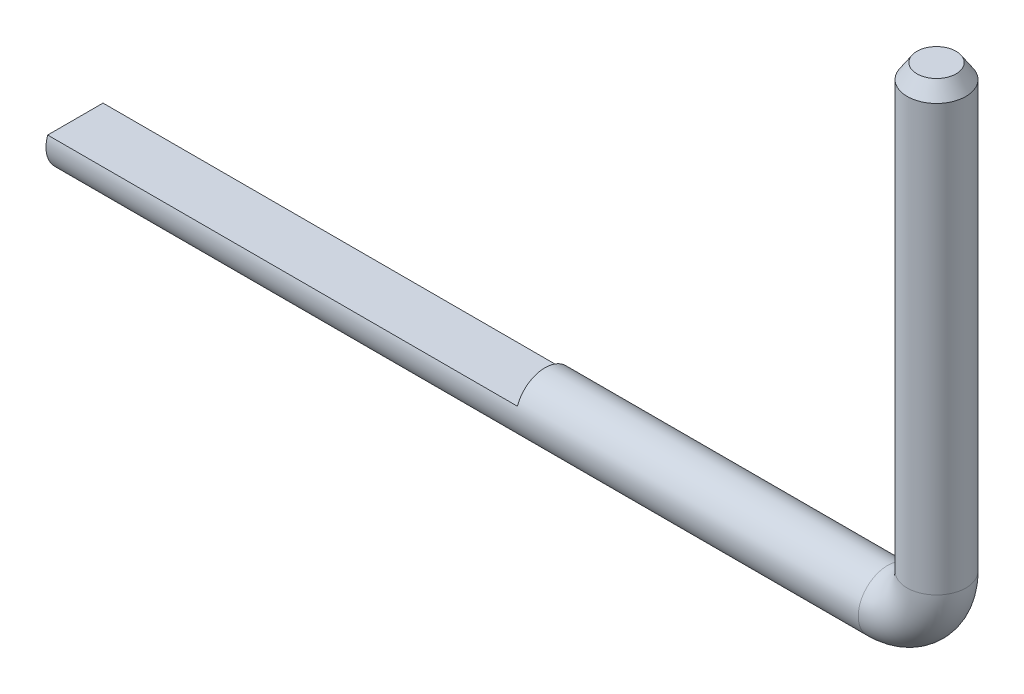
ISO-10303-21;
HEADER;
FILE_DESCRIPTION(('STEP AP214'),'2;1');
FILE_NAME('part.step','',(''),(''),'','','');
FILE_SCHEMA(('AUTOMOTIVE_DESIGN { 1 0 10303 214 1 1 1 1 }'));
ENDSEC;
DATA;
#1=APPLICATION_CONTEXT('core data for automotive mechanical design processes');
#2=APPLICATION_PROTOCOL_DEFINITION('international standard','automotive_design',2000,#1);
#3=PRODUCT_CONTEXT('',#1,'mechanical');
#4=PRODUCT('Part','Part','',(#3));
#5=PRODUCT_RELATED_PRODUCT_CATEGORY('part','',(#4));
#6=PRODUCT_DEFINITION_FORMATION('','',#4);
#7=PRODUCT_DEFINITION_CONTEXT('part definition',#1,'design');
#8=PRODUCT_DEFINITION('design','',#6,#7);
#9=PRODUCT_DEFINITION_SHAPE('','',#8);
#10=(LENGTH_UNIT() NAMED_UNIT(*) SI_UNIT(.MILLI.,.METRE.));
#11=(NAMED_UNIT(*) PLANE_ANGLE_UNIT() SI_UNIT($,.RADIAN.));
#12=(NAMED_UNIT(*) SI_UNIT($,.STERADIAN.) SOLID_ANGLE_UNIT());
#13=UNCERTAINTY_MEASURE_WITH_UNIT(LENGTH_MEASURE(1.E-05),#10,'distance_accuracy_value','');
#14=(GEOMETRIC_REPRESENTATION_CONTEXT(3) GLOBAL_UNCERTAINTY_ASSIGNED_CONTEXT((#13)) GLOBAL_UNIT_ASSIGNED_CONTEXT((#10,
#11,#12)) REPRESENTATION_CONTEXT('',''));
#15=CARTESIAN_POINT('',(0.,0.,0.));
#16=DIRECTION('',(0.,0.,1.));
#17=DIRECTION('',(1.,0.,0.));
#18=AXIS2_PLACEMENT_3D('',#15,#16,#17);
#19=CARTESIAN_POINT('',(88.,50.,0.));
#20=DIRECTION('',(0.,-1.,0.));
#21=DIRECTION('',(0.,0.,-1.));
#22=AXIS2_PLACEMENT_3D('',#19,#20,#21);
#23=PLANE('',#22);
#24=CARTESIAN_POINT('',(88.,50.0000000000114,0.));
#25=DIRECTION('',(0.,-1.,0.));
#26=DIRECTION('',(0.,0.,-1.));
#27=AXIS2_PLACEMENT_3D('',#24,#25,#26);
#28=CIRCLE('',#27,2.00000000000955);
#29=CARTESIAN_POINT('',(88.,50.0000000000114,-2.00000000000955));
#30=VERTEX_POINT('',#29);
#31=EDGE_CURVE('E19',#30,#30,#28,.T.);
#32=ORIENTED_EDGE('',*,*,#31,.F.);
#33=EDGE_LOOP('',(#32));
#34=FACE_BOUND('',#33,.T.);
#35=ADVANCED_FACE('F16',(#34),#23,.F.);
#36=CARTESIAN_POINT('',(88.,48.49999999999,0.));
#37=DIRECTION('',(0.,-1.,0.));
#38=DIRECTION('',(0.,0.,-1.));
#39=AXIS2_PLACEMENT_3D('',#36,#37,#38);
#40=CONICAL_SURFACE('',#39,3.00000000004275,0.588002603556313);
#41=CARTESIAN_POINT('',(88.,48.4999999999998,0.));
#42=DIRECTION('',(0.,1.,0.));
#43=DIRECTION('',(-1.,0.,0.));
#44=AXIS2_PLACEMENT_3D('',#41,#42,#43);
#45=CIRCLE('',#44,3.);
#46=CARTESIAN_POINT('',(85.,48.4999999999998,0.));
#47=VERTEX_POINT('',#46);
#48=EDGE_CURVE('E63',#47,#47,#45,.F.);
#49=ORIENTED_EDGE('',*,*,#48,.F.);
#50=EDGE_LOOP('',(#49));
#51=FACE_BOUND('',#50,.T.);
#52=ORIENTED_EDGE('',*,*,#31,.T.);
#53=EDGE_LOOP('',(#52));
#54=FACE_BOUND('',#53,.T.);
#55=ADVANCED_FACE('F82',(#51,#54),#40,.T.);
#56=CARTESIAN_POINT('',(88.,5.,0.));
#57=DIRECTION('',(0.,1.,0.));
#58=DIRECTION('',(-1.,0.,0.));
#59=AXIS2_PLACEMENT_3D('',#56,#57,#58);
#60=CYLINDRICAL_SURFACE('',#59,3.);
#61=CARTESIAN_POINT('',(88.,5.,0.));
#62=DIRECTION('',(0.,1.,0.));
#63=DIRECTION('',(1.,0.,0.));
#64=AXIS2_PLACEMENT_3D('',#61,#62,#63);
#65=CIRCLE('',#64,3.);
#66=CARTESIAN_POINT('',(91.,5.,0.));
#67=VERTEX_POINT('',#66);
#68=EDGE_CURVE('E66',#67,#67,#65,.F.);
#69=ORIENTED_EDGE('',*,*,#68,.F.);
#70=EDGE_LOOP('',(#69));
#71=FACE_BOUND('',#70,.T.);
#72=ORIENTED_EDGE('',*,*,#48,.T.);
#73=EDGE_LOOP('',(#72));
#74=FACE_BOUND('',#73,.T.);
#75=ADVANCED_FACE('F78',(#71,#74),#60,.T.);
#76=CARTESIAN_POINT('',(83.,5.,0.));
#77=DIRECTION('',(0.,0.,1.));
#78=DIRECTION('',(1.,0.,0.));
#79=AXIS2_PLACEMENT_3D('',#76,#77,#78);
#80=TOROIDAL_SURFACE('',#79,5.,3.);
#81=CARTESIAN_POINT('',(83.,0.,0.));
#82=DIRECTION('',(1.,0.,0.));
#83=DIRECTION('',(0.,0.,-1.));
#84=AXIS2_PLACEMENT_3D('',#81,#82,#83);
#85=CIRCLE('',#84,3.);
#86=CARTESIAN_POINT('',(83.,0.,-3.));
#87=VERTEX_POINT('',#86);
#88=EDGE_CURVE('E47',#87,#87,#85,.F.);
#89=ORIENTED_EDGE('',*,*,#88,.F.);
#90=EDGE_LOOP('',(#89));
#91=FACE_BOUND('',#90,.T.);
#92=ORIENTED_EDGE('',*,*,#68,.T.);
#93=EDGE_LOOP('',(#92));
#94=FACE_BOUND('',#93,.T.);
#95=ADVANCED_FACE('F74',(#91,#94),#80,.T.);
#96=CARTESIAN_POINT('',(0.,0.,0.));
#97=DIRECTION('',(-1.,0.,0.));
#98=DIRECTION('',(0.,-1.,0.));
#99=AXIS2_PLACEMENT_3D('',#96,#97,#98);
#100=PLANE('',#99);
#101=DIRECTION('',(0.,0.,1.));
#102=VECTOR('',#101,1.);
#103=CARTESIAN_POINT('',(0.,1.00000000000002,-5.));
#104=LINE('',#103,#102);
#105=CARTESIAN_POINT('',(0.,1.00000000000002,2.82842712474619));
#106=VERTEX_POINT('',#105);
#107=CARTESIAN_POINT('',(0.,1.00000000000002,-2.82842712474619));
#108=VERTEX_POINT('',#107);
#109=EDGE_CURVE('E43',#106,#108,#104,.F.);
#110=ORIENTED_EDGE('',*,*,#109,.T.);
#111=CARTESIAN_POINT('',(0.,0.,0.));
#112=DIRECTION('',(1.,0.,0.));
#113=DIRECTION('',(0.,0.,-1.));
#114=AXIS2_PLACEMENT_3D('',#111,#112,#113);
#115=CIRCLE('',#114,3.);
#116=EDGE_CURVE('E41',#106,#108,#115,.T.);
#117=ORIENTED_EDGE('',*,*,#116,.F.);
#118=EDGE_LOOP('',(#110,#117));
#119=FACE_BOUND('',#118,.T.);
#120=ADVANCED_FACE('F45',(#119),#100,.T.);
#121=CARTESIAN_POINT('',(48.,5.49590931430834,-5.));
#122=DIRECTION('',(1.,0.,0.));
#123=DIRECTION('',(0.,0.,-1.));
#124=AXIS2_PLACEMENT_3D('',#121,#122,#123);
#125=PLANE('',#124);
#126=CARTESIAN_POINT('',(48.,0.,0.));
#127=DIRECTION('',(1.,0.,0.));
#128=DIRECTION('',(0.,0.,-1.));
#129=AXIS2_PLACEMENT_3D('',#126,#127,#128);
#130=CIRCLE('',#129,3.);
#131=CARTESIAN_POINT('',(48.,1.00000000000002,-2.82842712474619));
#132=VERTEX_POINT('',#131);
#133=CARTESIAN_POINT('',(48.,1.00000000000002,2.82842712474619));
#134=VERTEX_POINT('',#133);
#135=EDGE_CURVE('E25',#132,#134,#130,.T.);
#136=ORIENTED_EDGE('',*,*,#135,.F.);
#137=DIRECTION('',(0.,0.,1.));
#138=VECTOR('',#137,1.);
#139=CARTESIAN_POINT('',(48.,1.00000000000002,-5.));
#140=LINE('',#139,#138);
#141=EDGE_CURVE('E33',#132,#134,#140,.T.);
#142=ORIENTED_EDGE('',*,*,#141,.T.);
#143=EDGE_LOOP('',(#136,#142));
#144=FACE_BOUND('',#143,.T.);
#145=ADVANCED_FACE('F99',(#144),#125,.F.);
#146=CARTESIAN_POINT('',(-2.68009542109733,1.00000000000002,-5.));
#147=DIRECTION('',(0.,-1.,0.));
#148=DIRECTION('',(1.,0.,0.));
#149=AXIS2_PLACEMENT_3D('',#146,#147,#148);
#150=PLANE('',#149);
#151=DIRECTION('',(1.,0.,0.));
#152=VECTOR('',#151,1.);
#153=CARTESIAN_POINT('',(0.,1.00000000000001,2.82842712474619));
#154=LINE('',#153,#152);
#155=EDGE_CURVE('E11',#134,#106,#154,.F.);
#156=ORIENTED_EDGE('',*,*,#155,.F.);
#157=ORIENTED_EDGE('',*,*,#141,.F.);
#158=DIRECTION('',(1.,0.,0.));
#159=VECTOR('',#158,1.);
#160=CARTESIAN_POINT('',(0.,1.00000000000002,-2.82842712474619));
#161=LINE('',#160,#159);
#162=EDGE_CURVE('E50',#108,#132,#161,.T.);
#163=ORIENTED_EDGE('',*,*,#162,.F.);
#164=ORIENTED_EDGE('',*,*,#109,.F.);
#165=EDGE_LOOP('',(#156,#157,#163,#164));
#166=FACE_BOUND('',#165,.T.);
#167=ADVANCED_FACE('F51',(#166),#150,.F.);
#168=CARTESIAN_POINT('',(0.,0.,0.));
#169=DIRECTION('',(1.,0.,0.));
#170=DIRECTION('',(0.,0.,-1.));
#171=AXIS2_PLACEMENT_3D('',#168,#169,#170);
#172=CYLINDRICAL_SURFACE('',#171,3.);
#173=ORIENTED_EDGE('',*,*,#135,.T.);
#174=ORIENTED_EDGE('',*,*,#155,.T.);
#175=ORIENTED_EDGE('',*,*,#116,.T.);
#176=ORIENTED_EDGE('',*,*,#162,.T.);
#177=EDGE_LOOP('',(#173,#174,#175,#176));
#178=FACE_BOUND('',#177,.T.);
#179=ORIENTED_EDGE('',*,*,#88,.T.);
#180=EDGE_LOOP('',(#179));
#181=FACE_BOUND('',#180,.T.);
#182=ADVANCED_FACE('F55',(#178,#181),#172,.T.);
#183=CLOSED_SHELL('',(#35,#55,#75,#95,#120,#145,#167,#182));
#184=MANIFOLD_SOLID_BREP('B1',#183);
#185=ADVANCED_BREP_SHAPE_REPRESENTATION('',(#18,#184),#14);
#186=SHAPE_DEFINITION_REPRESENTATION(#9,#185);
ENDSEC;
END-ISO-10303-21;
